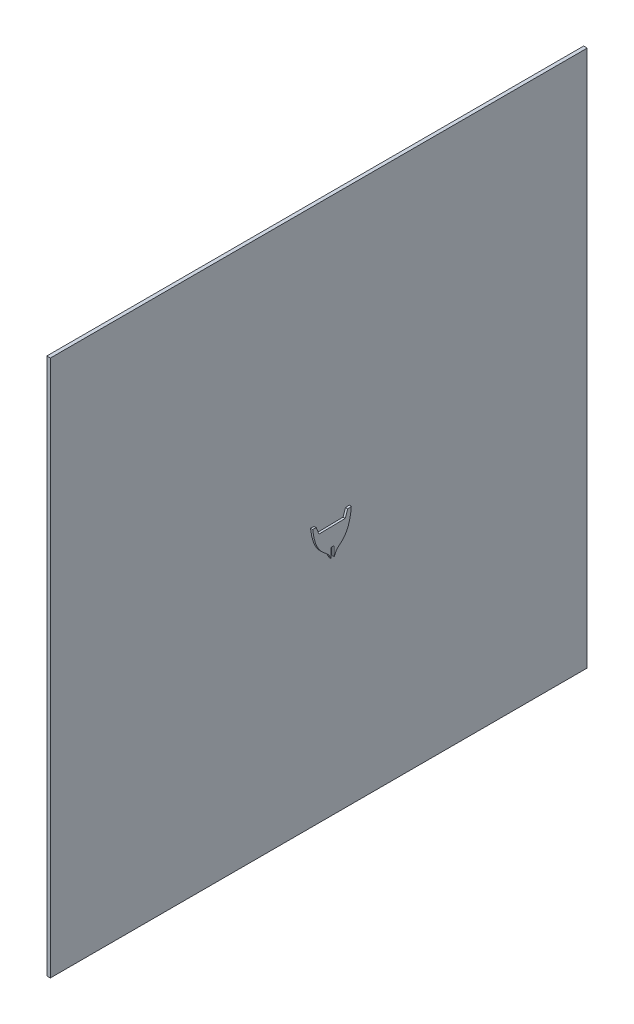
ISO-10303-21;
HEADER;
FILE_DESCRIPTION(('STEP AP214'),'2;1');
FILE_NAME('part.step','',(''),(''),'','','');
FILE_SCHEMA(('AUTOMOTIVE_DESIGN { 1 0 10303 214 1 1 1 1 }'));
ENDSEC;
DATA;
#1=APPLICATION_CONTEXT('core data for automotive mechanical design processes');
#2=APPLICATION_PROTOCOL_DEFINITION('international standard','automotive_design',2000,#1);
#3=PRODUCT_CONTEXT('',#1,'mechanical');
#4=PRODUCT('Part','Part','',(#3));
#5=PRODUCT_RELATED_PRODUCT_CATEGORY('part','',(#4));
#6=PRODUCT_DEFINITION_FORMATION('','',#4);
#7=PRODUCT_DEFINITION_CONTEXT('part definition',#1,'design');
#8=PRODUCT_DEFINITION('design','',#6,#7);
#9=PRODUCT_DEFINITION_SHAPE('','',#8);
#10=(LENGTH_UNIT() NAMED_UNIT(*) SI_UNIT(.MILLI.,.METRE.));
#11=(NAMED_UNIT(*) PLANE_ANGLE_UNIT() SI_UNIT($,.RADIAN.));
#12=(NAMED_UNIT(*) SI_UNIT($,.STERADIAN.) SOLID_ANGLE_UNIT());
#13=UNCERTAINTY_MEASURE_WITH_UNIT(LENGTH_MEASURE(1.E-05),#10,'distance_accuracy_value','');
#14=(GEOMETRIC_REPRESENTATION_CONTEXT(3) GLOBAL_UNCERTAINTY_ASSIGNED_CONTEXT((#13)) GLOBAL_UNIT_ASSIGNED_CONTEXT((#10,
#11,#12)) REPRESENTATION_CONTEXT('',''));
#15=CARTESIAN_POINT('',(0.,0.,0.));
#16=DIRECTION('',(0.,0.,1.));
#17=DIRECTION('',(1.,0.,0.));
#18=AXIS2_PLACEMENT_3D('',#15,#16,#17);
#19=CARTESIAN_POINT('',(6.,356.105695529386,60.4792665259948));
#20=CARTESIAN_POINT('',(6.,286.61749502081,52.7706352403442));
#21=CARTESIAN_POINT('',(6.,278.791819942509,24.4972285058388));
#22=CARTESIAN_POINT('',(6.,286.61749502081,15.6617889013058));
#23=CARTESIAN_POINT('',(6.,245.146035866798,4.44091292248795));
#24=B_SPLINE_CURVE_WITH_KNOTS('',4,(#19,#20,#21,#22,#23),.UNSPECIFIED.,.F.,.F.,(5,5),(0.,1.),.UNSPECIFIED.);
#25=DIRECTION('',(-1.,0.,0.));
#26=VECTOR('',#25,1.);
#27=SURFACE_OF_LINEAR_EXTRUSION('',#24,#26);
#28=CARTESIAN_POINT('',(0.,356.105695529386,60.4792665259948));
#29=CARTESIAN_POINT('',(0.,286.61749502081,52.7706352403442));
#30=CARTESIAN_POINT('',(0.,278.791819942509,24.4972285058388));
#31=CARTESIAN_POINT('',(0.,286.61749502081,15.6617889013058));
#32=CARTESIAN_POINT('',(0.,245.146035866798,4.44091292248795));
#33=B_SPLINE_CURVE_WITH_KNOTS('',4,(#28,#29,#30,#31,#32),.UNSPECIFIED.,.F.,.F.,(5,5),(0.,1.),.UNSPECIFIED.);
#34=CARTESIAN_POINT('',(0.,356.105695529386,60.4792665259948));
#35=VERTEX_POINT('',#34);
#36=CARTESIAN_POINT('',(0.,259.903423688903,9.20972532121438));
#37=VERTEX_POINT('',#36);
#38=EDGE_CURVE('E143',#35,#37,#33,.T.);
#39=ORIENTED_EDGE('',*,*,#38,.T.);
#40=DIRECTION('',(1.,0.,0.));
#41=VECTOR('',#40,1.);
#42=CARTESIAN_POINT('',(0.,259.903423688903,9.20972532121438));
#43=LINE('',#42,#41);
#44=CARTESIAN_POINT('',(6.,259.903423688903,9.20972532121438));
#45=VERTEX_POINT('',#44);
#46=EDGE_CURVE('E149',#37,#45,#43,.T.);
#47=ORIENTED_EDGE('',*,*,#46,.T.);
#48=CARTESIAN_POINT('',(6.,356.105695529386,60.4792665259948));
#49=VERTEX_POINT('',#48);
#50=EDGE_CURVE('E167',#49,#45,#24,.T.);
#51=ORIENTED_EDGE('',*,*,#50,.F.);
#52=DIRECTION('',(-1.,0.,0.));
#53=VECTOR('',#52,1.);
#54=CARTESIAN_POINT('',(6.,356.105695529386,60.4792665259948));
#55=LINE('',#54,#53);
#56=EDGE_CURVE('E139',#49,#35,#55,.T.);
#57=ORIENTED_EDGE('',*,*,#56,.T.);
#58=EDGE_LOOP('',(#39,#47,#51,#57));
#59=FACE_BOUND('',#58,.T.);
#60=ADVANCED_FACE('F45',(#59),#27,.F.);
#61=CARTESIAN_POINT('',(6.,245.146035866798,4.44091292248795));
#62=CARTESIAN_POINT('',(6.,286.996692264015,-5.27055149936918));
#63=CARTESIAN_POINT('',(6.,279.496161382421,-14.3836311067655));
#64=CARTESIAN_POINT('',(6.,288.340732696359,-42.3550500389287));
#65=CARTESIAN_POINT('',(6.,358.062538617364,-47.5418395403267));
#66=B_SPLINE_CURVE_WITH_KNOTS('',4,(#61,#62,#63,#64,#65),.UNSPECIFIED.,.F.,.F.,(5,5),(0.,1.),.UNSPECIFIED.);
#67=DIRECTION('',(-1.,0.,0.));
#68=VECTOR('',#67,1.);
#69=SURFACE_OF_LINEAR_EXTRUSION('',#66,#68);
#70=CARTESIAN_POINT('',(6.,260.066462084205,0.209725321214382));
#71=VERTEX_POINT('',#70);
#72=CARTESIAN_POINT('',(6.,358.062538617364,-47.5418395403267));
#73=VERTEX_POINT('',#72);
#74=EDGE_CURVE('E104',#71,#73,#66,.T.);
#75=ORIENTED_EDGE('',*,*,#74,.F.);
#76=DIRECTION('',(1.,0.,0.));
#77=VECTOR('',#76,1.);
#78=CARTESIAN_POINT('',(0.,260.066462084205,0.209725321214382));
#79=LINE('',#78,#77);
#80=CARTESIAN_POINT('',(0.,260.066462084205,0.209725321214382));
#81=VERTEX_POINT('',#80);
#82=EDGE_CURVE('E195',#81,#71,#79,.T.);
#83=ORIENTED_EDGE('',*,*,#82,.F.);
#84=CARTESIAN_POINT('',(0.,245.146035866798,4.44091292248795));
#85=CARTESIAN_POINT('',(0.,286.996692264015,-5.27055149936918));
#86=CARTESIAN_POINT('',(0.,279.496161382421,-14.3836311067655));
#87=CARTESIAN_POINT('',(0.,288.340732696359,-42.3550500389287));
#88=CARTESIAN_POINT('',(0.,358.062538617364,-47.5418395403267));
#89=B_SPLINE_CURVE_WITH_KNOTS('',4,(#84,#85,#86,#87,#88),.UNSPECIFIED.,.F.,.F.,(5,5),(0.,1.),.UNSPECIFIED.);
#90=CARTESIAN_POINT('',(0.,358.062538617364,-47.5418395403267));
#91=VERTEX_POINT('',#90);
#92=EDGE_CURVE('E148',#81,#91,#89,.T.);
#93=ORIENTED_EDGE('',*,*,#92,.T.);
#94=DIRECTION('',(-1.,0.,0.));
#95=VECTOR('',#94,1.);
#96=CARTESIAN_POINT('',(6.,358.062538617364,-47.5418395403267));
#97=LINE('',#96,#95);
#98=EDGE_CURVE('E13',#73,#91,#97,.T.);
#99=ORIENTED_EDGE('',*,*,#98,.F.);
#100=EDGE_LOOP('',(#75,#83,#93,#99));
#101=FACE_BOUND('',#100,.T.);
#102=ADVANCED_FACE('F207',(#101),#69,.F.);
#103=CARTESIAN_POINT('',(6.,358.062538617364,-47.5418395403267));
#104=DIRECTION('',(0.,-0.994938698469687,-0.100483761312194));
#105=DIRECTION('',(0.,0.100483761312194,-0.994938698469687));
#106=AXIS2_PLACEMENT_3D('',#103,#104,#105);
#107=PLANE('',#106);
#108=DIRECTION('',(0.,-0.100483761312194,0.994938698469687));
#109=VECTOR('',#108,1.);
#110=CARTESIAN_POINT('',(0.,358.062538617364,-47.5418395403267));
#111=LINE('',#110,#109);
#112=CARTESIAN_POINT('',(0.,357.038033491365,-37.3977149243068));
#113=VERTEX_POINT('',#112);
#114=EDGE_CURVE('E156',#91,#113,#111,.T.);
#115=ORIENTED_EDGE('',*,*,#114,.T.);
#116=DIRECTION('',(-1.,0.,0.));
#117=VECTOR('',#116,1.);
#118=CARTESIAN_POINT('',(6.,357.038033491365,-37.3977149243068));
#119=LINE('',#118,#117);
#120=CARTESIAN_POINT('',(6.,357.038033491365,-37.3977149243068));
#121=VERTEX_POINT('',#120);
#122=EDGE_CURVE('E53',#121,#113,#119,.T.);
#123=ORIENTED_EDGE('',*,*,#122,.F.);
#124=DIRECTION('',(0.,-0.100483761312194,0.994938698469687));
#125=VECTOR('',#124,1.);
#126=CARTESIAN_POINT('',(6.,358.062538617364,-47.5418395403267));
#127=LINE('',#126,#125);
#128=EDGE_CURVE('E189',#73,#121,#127,.T.);
#129=ORIENTED_EDGE('',*,*,#128,.F.);
#130=ORIENTED_EDGE('',*,*,#98,.T.);
#131=EDGE_LOOP('',(#115,#123,#129,#130));
#132=FACE_BOUND('',#131,.T.);
#133=ADVANCED_FACE('F210',(#132),#107,.F.);
#134=CARTESIAN_POINT('',(6.,357.038033491365,-37.3977149243068));
#135=DIRECTION('',(0.,-0.329497931100059,-0.944156297124995));
#136=DIRECTION('',(0.,0.944156297124995,-0.329497931100059));
#137=AXIS2_PLACEMENT_3D('',#134,#135,#136);
#138=PLANE('',#137);
#139=DIRECTION('',(0.,-0.944156297124995,0.329497931100058));
#140=VECTOR('',#139,1.);
#141=CARTESIAN_POINT('',(0.,357.038033491365,-37.3977149243068));
#142=LINE('',#141,#140);
#143=CARTESIAN_POINT('',(0.,337.397786243656,-30.5435310840679));
#144=VERTEX_POINT('',#143);
#145=EDGE_CURVE('E161',#113,#144,#142,.T.);
#146=ORIENTED_EDGE('',*,*,#145,.T.);
#147=DIRECTION('',(-1.,0.,0.));
#148=VECTOR('',#147,1.);
#149=CARTESIAN_POINT('',(6.,337.397786243656,-30.5435310840679));
#150=LINE('',#149,#148);
#151=CARTESIAN_POINT('',(6.,337.397786243656,-30.5435310840679));
#152=VERTEX_POINT('',#151);
#153=EDGE_CURVE('E134',#152,#144,#150,.T.);
#154=ORIENTED_EDGE('',*,*,#153,.F.);
#155=DIRECTION('',(0.,-0.944156297124995,0.329497931100058));
#156=VECTOR('',#155,1.);
#157=CARTESIAN_POINT('',(6.,357.038033491365,-37.3977149243068));
#158=LINE('',#157,#156);
#159=EDGE_CURVE('E122',#121,#152,#158,.T.);
#160=ORIENTED_EDGE('',*,*,#159,.F.);
#161=ORIENTED_EDGE('',*,*,#122,.T.);
#162=EDGE_LOOP('',(#146,#154,#160,#161));
#163=FACE_BOUND('',#162,.T.);
#164=ADVANCED_FACE('F174',(#163),#138,.F.);
#165=CARTESIAN_POINT('',(6.,336.070161183109,42.7436570213848));
#166=DIRECTION('',(0.,-0.999835956927465,-0.0181124055536429));
#167=DIRECTION('',(0.,0.0181124055536429,-0.999835956927466));
#168=AXIS2_PLACEMENT_3D('',#165,#166,#167);
#169=PLANE('',#168);
#170=DIRECTION('',(0.,-0.0181124055536429,0.999835956927465));
#171=VECTOR('',#170,1.);
#172=CARTESIAN_POINT('',(0.,336.070161183109,42.7436570213848));
#173=LINE('',#172,#171);
#174=CARTESIAN_POINT('',(0.,336.070161183109,42.7436570213848));
#175=VERTEX_POINT('',#174);
#176=EDGE_CURVE('E131',#144,#175,#173,.T.);
#177=ORIENTED_EDGE('',*,*,#176,.T.);
#178=DIRECTION('',(-1.,0.,0.));
#179=VECTOR('',#178,1.);
#180=CARTESIAN_POINT('',(6.,336.070161183109,42.7436570213848));
#181=LINE('',#180,#179);
#182=CARTESIAN_POINT('',(6.,336.070161183109,42.7436570213848));
#183=VERTEX_POINT('',#182);
#184=EDGE_CURVE('E128',#183,#175,#181,.T.);
#185=ORIENTED_EDGE('',*,*,#184,.F.);
#186=DIRECTION('',(0.,-0.0181124055536429,0.999835956927465));
#187=VECTOR('',#186,1.);
#188=CARTESIAN_POINT('',(6.,336.070161183109,42.7436570213848));
#189=LINE('',#188,#187);
#190=EDGE_CURVE('E115',#152,#183,#189,.T.);
#191=ORIENTED_EDGE('',*,*,#190,.F.);
#192=ORIENTED_EDGE('',*,*,#153,.T.);
#193=EDGE_LOOP('',(#177,#185,#191,#192));
#194=FACE_BOUND('',#193,.T.);
#195=ADVANCED_FACE('F129',(#194),#169,.F.);
#196=CARTESIAN_POINT('',(6.,355.449271317442,50.3046912408778));
#197=DIRECTION('',(0.,-0.363478014358725,0.931602776443822));
#198=DIRECTION('',(0.,-0.931602776443822,-0.363478014358725));
#199=AXIS2_PLACEMENT_3D('',#196,#197,#198);
#200=PLANE('',#199);
#201=DIRECTION('',(0.,0.931602776443822,0.363478014358725));
#202=VECTOR('',#201,1.);
#203=CARTESIAN_POINT('',(0.,355.449271317442,50.3046912408778));
#204=LINE('',#203,#202);
#205=CARTESIAN_POINT('',(0.,355.449271317442,50.3046912408778));
#206=VERTEX_POINT('',#205);
#207=EDGE_CURVE('E164',#175,#206,#204,.T.);
#208=ORIENTED_EDGE('',*,*,#207,.T.);
#209=DIRECTION('',(-1.,0.,0.));
#210=VECTOR('',#209,1.);
#211=CARTESIAN_POINT('',(6.,355.449271317442,50.3046912408778));
#212=LINE('',#211,#210);
#213=CARTESIAN_POINT('',(6.,355.449271317442,50.3046912408778));
#214=VERTEX_POINT('',#213);
#215=EDGE_CURVE('E135',#214,#206,#212,.T.);
#216=ORIENTED_EDGE('',*,*,#215,.F.);
#217=DIRECTION('',(0.,0.931602776443822,0.363478014358725));
#218=VECTOR('',#217,1.);
#219=CARTESIAN_POINT('',(6.,355.449271317442,50.3046912408778));
#220=LINE('',#219,#218);
#221=EDGE_CURVE('E119',#183,#214,#220,.T.);
#222=ORIENTED_EDGE('',*,*,#221,.F.);
#223=ORIENTED_EDGE('',*,*,#184,.T.);
#224=EDGE_LOOP('',(#208,#216,#222,#223));
#225=FACE_BOUND('',#224,.T.);
#226=ADVANCED_FACE('F137',(#225),#200,.F.);
#227=CARTESIAN_POINT('',(6.,356.105695529386,60.4792665259948));
#228=DIRECTION('',(0.,-0.997925308968458,0.064382277997968));
#229=DIRECTION('',(0.,-0.064382277997968,-0.997925308968458));
#230=AXIS2_PLACEMENT_3D('',#227,#228,#229);
#231=PLANE('',#230);
#232=DIRECTION('',(0.,0.064382277997968,0.997925308968458));
#233=VECTOR('',#232,1.);
#234=CARTESIAN_POINT('',(0.,356.105695529386,60.4792665259948));
#235=LINE('',#234,#233);
#236=EDGE_CURVE('E96',#206,#35,#235,.T.);
#237=ORIENTED_EDGE('',*,*,#236,.T.);
#238=ORIENTED_EDGE('',*,*,#56,.F.);
#239=DIRECTION('',(0.,0.064382277997968,0.997925308968458));
#240=VECTOR('',#239,1.);
#241=CARTESIAN_POINT('',(6.,356.105695529386,60.4792665259948));
#242=LINE('',#241,#240);
#243=EDGE_CURVE('E69',#214,#49,#242,.T.);
#244=ORIENTED_EDGE('',*,*,#243,.F.);
#245=ORIENTED_EDGE('',*,*,#215,.T.);
#246=EDGE_LOOP('',(#237,#238,#244,#245));
#247=FACE_BOUND('',#246,.T.);
#248=ADVANCED_FACE('F183',(#247),#231,.F.);
#249=CARTESIAN_POINT('',(6.,285.433913201107,30.3520779406322));
#250=DIRECTION('',(-1.,0.,0.));
#251=DIRECTION('',(0.,0.,1.));
#252=AXIS2_PLACEMENT_3D('',#249,#250,#251);
#253=PLANE('',#252);
#254=ORIENTED_EDGE('',*,*,#50,.T.);
#255=DIRECTION('',(0.,-0.999835956927465,-0.0181124055536429));
#256=VECTOR('',#255,1.);
#257=CARTESIAN_POINT('',(6.,259.903423688903,9.20972532121438));
#258=LINE('',#257,#256);
#259=CARTESIAN_POINT('',(6.,286.903423688903,9.69884050712066));
#260=VERTEX_POINT('',#259);
#261=EDGE_CURVE('E311',#260,#45,#258,.T.);
#262=ORIENTED_EDGE('',*,*,#261,.F.);
#263=DIRECTION('',(0.,-0.0181124055536469,0.999835956927465));
#264=VECTOR('',#263,1.);
#265=CARTESIAN_POINT('',(6.,286.903423688903,9.69884050712066));
#266=LINE('',#265,#264);
#267=CARTESIAN_POINT('',(6.,287.066462084205,0.698840507120659));
#268=VERTEX_POINT('',#267);
#269=EDGE_CURVE('E319',#268,#260,#266,.T.);
#270=ORIENTED_EDGE('',*,*,#269,.F.);
#271=DIRECTION('',(0.,0.999835956927465,0.0181124055536429));
#272=VECTOR('',#271,1.);
#273=CARTESIAN_POINT('',(6.,287.066462084205,0.698840507120659));
#274=LINE('',#273,#272);
#275=EDGE_CURVE('E323',#71,#268,#274,.T.);
#276=ORIENTED_EDGE('',*,*,#275,.F.);
#277=ORIENTED_EDGE('',*,*,#74,.T.);
#278=ORIENTED_EDGE('',*,*,#128,.T.);
#279=ORIENTED_EDGE('',*,*,#159,.T.);
#280=ORIENTED_EDGE('',*,*,#190,.T.);
#281=ORIENTED_EDGE('',*,*,#221,.T.);
#282=ORIENTED_EDGE('',*,*,#243,.T.);
#283=EDGE_LOOP('',(#254,#262,#270,#276,#277,#278,#279,#280,#281,#282));
#284=FACE_BOUND('',#283,.T.);
#285=ADVANCED_FACE('F117',(#284),#253,.F.);
#286=CARTESIAN_POINT('',(0.,285.433913201107,30.3520779406322));
#287=DIRECTION('',(-1.,0.,0.));
#288=DIRECTION('',(0.,0.,1.));
#289=AXIS2_PLACEMENT_3D('',#286,#287,#288);
#290=PLANE('',#289);
#291=DIRECTION('',(0.,-0.999835956927465,-0.0181124055536429));
#292=VECTOR('',#291,1.);
#293=CARTESIAN_POINT('',(0.,259.903423688903,9.20972532121438));
#294=LINE('',#293,#292);
#295=CARTESIAN_POINT('',(0.,286.903423688903,9.69884050712066));
#296=VERTEX_POINT('',#295);
#297=EDGE_CURVE('E332',#296,#37,#294,.T.);
#298=ORIENTED_EDGE('',*,*,#297,.T.);
#299=ORIENTED_EDGE('',*,*,#38,.F.);
#300=ORIENTED_EDGE('',*,*,#236,.F.);
#301=ORIENTED_EDGE('',*,*,#207,.F.);
#302=ORIENTED_EDGE('',*,*,#176,.F.);
#303=ORIENTED_EDGE('',*,*,#145,.F.);
#304=ORIENTED_EDGE('',*,*,#114,.F.);
#305=ORIENTED_EDGE('',*,*,#92,.F.);
#306=DIRECTION('',(0.,0.999835956927465,0.0181124055536429));
#307=VECTOR('',#306,1.);
#308=CARTESIAN_POINT('',(0.,287.066462084205,0.698840507120659));
#309=LINE('',#308,#307);
#310=CARTESIAN_POINT('',(0.,287.066462084205,0.698840507120666));
#311=VERTEX_POINT('',#310);
#312=EDGE_CURVE('E318',#81,#311,#309,.T.);
#313=ORIENTED_EDGE('',*,*,#312,.T.);
#314=DIRECTION('',(0.,-0.0181124055536469,0.999835956927465));
#315=VECTOR('',#314,1.);
#316=CARTESIAN_POINT('',(0.,286.903423688903,9.69884050712066));
#317=LINE('',#316,#315);
#318=EDGE_CURVE('E60',#311,#296,#317,.T.);
#319=ORIENTED_EDGE('',*,*,#318,.T.);
#320=EDGE_LOOP('',(#298,#299,#300,#301,#302,#303,#304,#305,#313,#319));
#321=FACE_BOUND('',#320,.T.);
#322=ADVANCED_FACE('F180',(#321),#290,.T.);
#323=CARTESIAN_POINT('',(0.,259.903423688903,9.20972532121438));
#324=DIRECTION('',(0.,-0.0181124055536429,0.999835956927465));
#325=DIRECTION('',(0.,-0.999835956927466,-0.0181124055536429));
#326=AXIS2_PLACEMENT_3D('',#323,#324,#325);
#327=PLANE('',#326);
#328=ORIENTED_EDGE('',*,*,#261,.T.);
#329=ORIENTED_EDGE('',*,*,#46,.F.);
#330=ORIENTED_EDGE('',*,*,#297,.F.);
#331=DIRECTION('',(1.,0.,0.));
#332=VECTOR('',#331,1.);
#333=CARTESIAN_POINT('',(0.,286.903423688903,9.69884050712066));
#334=LINE('',#333,#332);
#335=EDGE_CURVE('E314',#296,#260,#334,.T.);
#336=ORIENTED_EDGE('',*,*,#335,.T.);
#337=EDGE_LOOP('',(#328,#329,#330,#336));
#338=FACE_BOUND('',#337,.T.);
#339=ADVANCED_FACE('F224',(#338),#327,.F.);
#340=CARTESIAN_POINT('',(0.,286.903423688903,9.69884050712066));
#341=DIRECTION('',(0.,0.999835956927465,0.0181124055536469));
#342=DIRECTION('',(0.,-0.0181124055536469,0.999835956927465));
#343=AXIS2_PLACEMENT_3D('',#340,#341,#342);
#344=PLANE('',#343);
#345=ORIENTED_EDGE('',*,*,#269,.T.);
#346=ORIENTED_EDGE('',*,*,#335,.F.);
#347=ORIENTED_EDGE('',*,*,#318,.F.);
#348=DIRECTION('',(1.,0.,0.));
#349=VECTOR('',#348,1.);
#350=CARTESIAN_POINT('',(0.,287.066462084205,0.698840507120659));
#351=LINE('',#350,#349);
#352=EDGE_CURVE('E328',#311,#268,#351,.T.);
#353=ORIENTED_EDGE('',*,*,#352,.T.);
#354=EDGE_LOOP('',(#345,#346,#347,#353));
#355=FACE_BOUND('',#354,.T.);
#356=ADVANCED_FACE('F230',(#355),#344,.F.);
#357=CARTESIAN_POINT('',(0.,287.066462084205,0.698840507120659));
#358=DIRECTION('',(0.,0.0181124055536428,-0.999835956927465));
#359=DIRECTION('',(0.,0.999835956927466,0.0181124055536429));
#360=AXIS2_PLACEMENT_3D('',#357,#358,#359);
#361=PLANE('',#360);
#362=ORIENTED_EDGE('',*,*,#275,.T.);
#363=ORIENTED_EDGE('',*,*,#352,.F.);
#364=ORIENTED_EDGE('',*,*,#312,.F.);
#365=ORIENTED_EDGE('',*,*,#82,.T.);
#366=EDGE_LOOP('',(#362,#363,#364,#365));
#367=FACE_BOUND('',#366,.T.);
#368=ADVANCED_FACE('F227',(#367),#361,.F.);
#369=CLOSED_SHELL('',(#60,#102,#133,#164,#195,#226,#248,#285,#322,#339,#356,#368));
#370=MANIFOLD_SOLID_BREP('B2',#369);
#371=CARTESIAN_POINT('',(-10.,0.,0.));
#372=DIRECTION('',(-1.,0.,0.));
#373=DIRECTION('',(0.,0.,1.));
#374=AXIS2_PLACEMENT_3D('',#371,#372,#373);
#375=PLANE('',#374);
#376=DIRECTION('',(0.,0.,-1.));
#377=VECTOR('',#376,1.);
#378=CARTESIAN_POINT('',(-10.,-378.710653275796,777.274991403029));
#379=LINE('',#378,#377);
#380=CARTESIAN_POINT('',(-10.,-378.710653275796,777.274991403029));
#381=VERTEX_POINT('',#380);
#382=CARTESIAN_POINT('',(-10.,-378.710653275796,-722.725008596971));
#383=VERTEX_POINT('',#382);
#384=EDGE_CURVE('E355',#381,#383,#379,.T.);
#385=ORIENTED_EDGE('',*,*,#384,.T.);
#386=DIRECTION('',(0.,-1.,0.));
#387=VECTOR('',#386,1.);
#388=CARTESIAN_POINT('',(-10.,1121.2893467242,-722.725008596971));
#389=LINE('',#388,#387);
#390=CARTESIAN_POINT('',(-10.,1121.2893467242,-722.725008596971));
#391=VERTEX_POINT('',#390);
#392=EDGE_CURVE('E389',#391,#383,#389,.T.);
#393=ORIENTED_EDGE('',*,*,#392,.F.);
#394=DIRECTION('',(0.,0.,-1.));
#395=VECTOR('',#394,1.);
#396=CARTESIAN_POINT('',(-10.,1121.2893467242,777.274991403029));
#397=LINE('',#396,#395);
#398=CARTESIAN_POINT('',(-10.,1121.2893467242,777.274991403029));
#399=VERTEX_POINT('',#398);
#400=EDGE_CURVE('E386',#399,#391,#397,.T.);
#401=ORIENTED_EDGE('',*,*,#400,.F.);
#402=DIRECTION('',(0.,-1.,0.));
#403=VECTOR('',#402,1.);
#404=CARTESIAN_POINT('',(-10.,1121.2893467242,777.274991403029));
#405=LINE('',#404,#403);
#406=EDGE_CURVE('E383',#399,#381,#405,.T.);
#407=ORIENTED_EDGE('',*,*,#406,.T.);
#408=EDGE_LOOP('',(#385,#393,#401,#407));
#409=FACE_BOUND('',#408,.T.);
#410=ADVANCED_FACE('F346',(#409),#375,.F.);
#411=CARTESIAN_POINT('',(-20.,0.,0.));
#412=DIRECTION('',(-1.,0.,0.));
#413=DIRECTION('',(0.,0.,1.));
#414=AXIS2_PLACEMENT_3D('',#411,#412,#413);
#415=PLANE('',#414);
#416=DIRECTION('',(0.,0.,-1.));
#417=VECTOR('',#416,1.);
#418=CARTESIAN_POINT('',(-20.,-378.710653275796,777.274991403029));
#419=LINE('',#418,#417);
#420=CARTESIAN_POINT('',(-20.,-378.710653275796,777.274991403029));
#421=VERTEX_POINT('',#420);
#422=CARTESIAN_POINT('',(-20.,-378.710653275796,-722.725008596971));
#423=VERTEX_POINT('',#422);
#424=EDGE_CURVE('E43',#421,#423,#419,.T.);
#425=ORIENTED_EDGE('',*,*,#424,.F.);
#426=DIRECTION('',(0.,-1.,0.));
#427=VECTOR('',#426,1.);
#428=CARTESIAN_POINT('',(-20.,1121.2893467242,777.274991403029));
#429=LINE('',#428,#427);
#430=CARTESIAN_POINT('',(-20.,1121.2893467242,777.274991403029));
#431=VERTEX_POINT('',#430);
#432=EDGE_CURVE('E402',#431,#421,#429,.T.);
#433=ORIENTED_EDGE('',*,*,#432,.F.);
#434=DIRECTION('',(0.,0.,-1.));
#435=VECTOR('',#434,1.);
#436=CARTESIAN_POINT('',(-20.,1121.2893467242,777.274991403029));
#437=LINE('',#436,#435);
#438=CARTESIAN_POINT('',(-20.,1121.2893467242,-722.725008596971));
#439=VERTEX_POINT('',#438);
#440=EDGE_CURVE('E393',#431,#439,#437,.T.);
#441=ORIENTED_EDGE('',*,*,#440,.T.);
#442=DIRECTION('',(0.,-1.,0.));
#443=VECTOR('',#442,1.);
#444=CARTESIAN_POINT('',(-20.,1121.2893467242,-722.725008596971));
#445=LINE('',#444,#443);
#446=EDGE_CURVE('E364',#439,#423,#445,.T.);
#447=ORIENTED_EDGE('',*,*,#446,.T.);
#448=EDGE_LOOP('',(#425,#433,#441,#447));
#449=FACE_BOUND('',#448,.T.);
#450=ADVANCED_FACE('F442',(#449),#415,.T.);
#451=CARTESIAN_POINT('',(-20.,1121.2893467242,777.274991403029));
#452=DIRECTION('',(0.,0.,1.));
#453=DIRECTION('',(1.,0.,0.));
#454=AXIS2_PLACEMENT_3D('',#451,#452,#453);
#455=PLANE('',#454);
#456=ORIENTED_EDGE('',*,*,#406,.F.);
#457=DIRECTION('',(1.,0.,0.));
#458=VECTOR('',#457,1.);
#459=CARTESIAN_POINT('',(-20.,1121.2893467242,777.274991403029));
#460=LINE('',#459,#458);
#461=EDGE_CURVE('E398',#431,#399,#460,.T.);
#462=ORIENTED_EDGE('',*,*,#461,.F.);
#463=ORIENTED_EDGE('',*,*,#432,.T.);
#464=DIRECTION('',(1.,0.,0.));
#465=VECTOR('',#464,1.);
#466=CARTESIAN_POINT('',(-20.,-378.710653275796,777.274991403029));
#467=LINE('',#466,#465);
#468=EDGE_CURVE('E394',#421,#381,#467,.T.);
#469=ORIENTED_EDGE('',*,*,#468,.T.);
#470=EDGE_LOOP('',(#456,#462,#463,#469));
#471=FACE_BOUND('',#470,.T.);
#472=ADVANCED_FACE('F403',(#471),#455,.T.);
#473=CARTESIAN_POINT('',(-20.,-378.710653275796,777.274991403029));
#474=DIRECTION('',(0.,-1.,0.));
#475=DIRECTION('',(0.,0.,-1.));
#476=AXIS2_PLACEMENT_3D('',#473,#474,#475);
#477=PLANE('',#476);
#478=ORIENTED_EDGE('',*,*,#384,.F.);
#479=ORIENTED_EDGE('',*,*,#468,.F.);
#480=ORIENTED_EDGE('',*,*,#424,.T.);
#481=DIRECTION('',(1.,0.,0.));
#482=VECTOR('',#481,1.);
#483=CARTESIAN_POINT('',(-20.,-378.710653275796,-722.725008596971));
#484=LINE('',#483,#482);
#485=EDGE_CURVE('E414',#423,#383,#484,.T.);
#486=ORIENTED_EDGE('',*,*,#485,.T.);
#487=EDGE_LOOP('',(#478,#479,#480,#486));
#488=FACE_BOUND('',#487,.T.);
#489=ADVANCED_FACE('F444',(#488),#477,.T.);
#490=CARTESIAN_POINT('',(-20.,1121.2893467242,777.274991403029));
#491=DIRECTION('',(0.,-1.,0.));
#492=DIRECTION('',(0.,0.,-1.));
#493=AXIS2_PLACEMENT_3D('',#490,#491,#492);
#494=PLANE('',#493);
#495=ORIENTED_EDGE('',*,*,#400,.T.);
#496=DIRECTION('',(1.,0.,0.));
#497=VECTOR('',#496,1.);
#498=CARTESIAN_POINT('',(-20.,1121.2893467242,-722.725008596971));
#499=LINE('',#498,#497);
#500=EDGE_CURVE('E418',#439,#391,#499,.T.);
#501=ORIENTED_EDGE('',*,*,#500,.F.);
#502=ORIENTED_EDGE('',*,*,#440,.F.);
#503=ORIENTED_EDGE('',*,*,#461,.T.);
#504=EDGE_LOOP('',(#495,#501,#502,#503));
#505=FACE_BOUND('',#504,.T.);
#506=ADVANCED_FACE('F399',(#505),#494,.F.);
#507=CARTESIAN_POINT('',(-20.,1121.2893467242,-722.725008596971));
#508=DIRECTION('',(0.,0.,1.));
#509=DIRECTION('',(1.,0.,0.));
#510=AXIS2_PLACEMENT_3D('',#507,#508,#509);
#511=PLANE('',#510);
#512=ORIENTED_EDGE('',*,*,#392,.T.);
#513=ORIENTED_EDGE('',*,*,#485,.F.);
#514=ORIENTED_EDGE('',*,*,#446,.F.);
#515=ORIENTED_EDGE('',*,*,#500,.T.);
#516=EDGE_LOOP('',(#512,#513,#514,#515));
#517=FACE_BOUND('',#516,.T.);
#518=ADVANCED_FACE('F429',(#517),#511,.F.);
#519=CLOSED_SHELL('',(#410,#450,#472,#489,#506,#518));
#520=MANIFOLD_SOLID_BREP('B7_NOT_SHOWN',#519);
#521=ADVANCED_BREP_SHAPE_REPRESENTATION('',(#18,#370,#520),#14);
#522=SHAPE_DEFINITION_REPRESENTATION(#9,#521);
ENDSEC;
END-ISO-10303-21;
